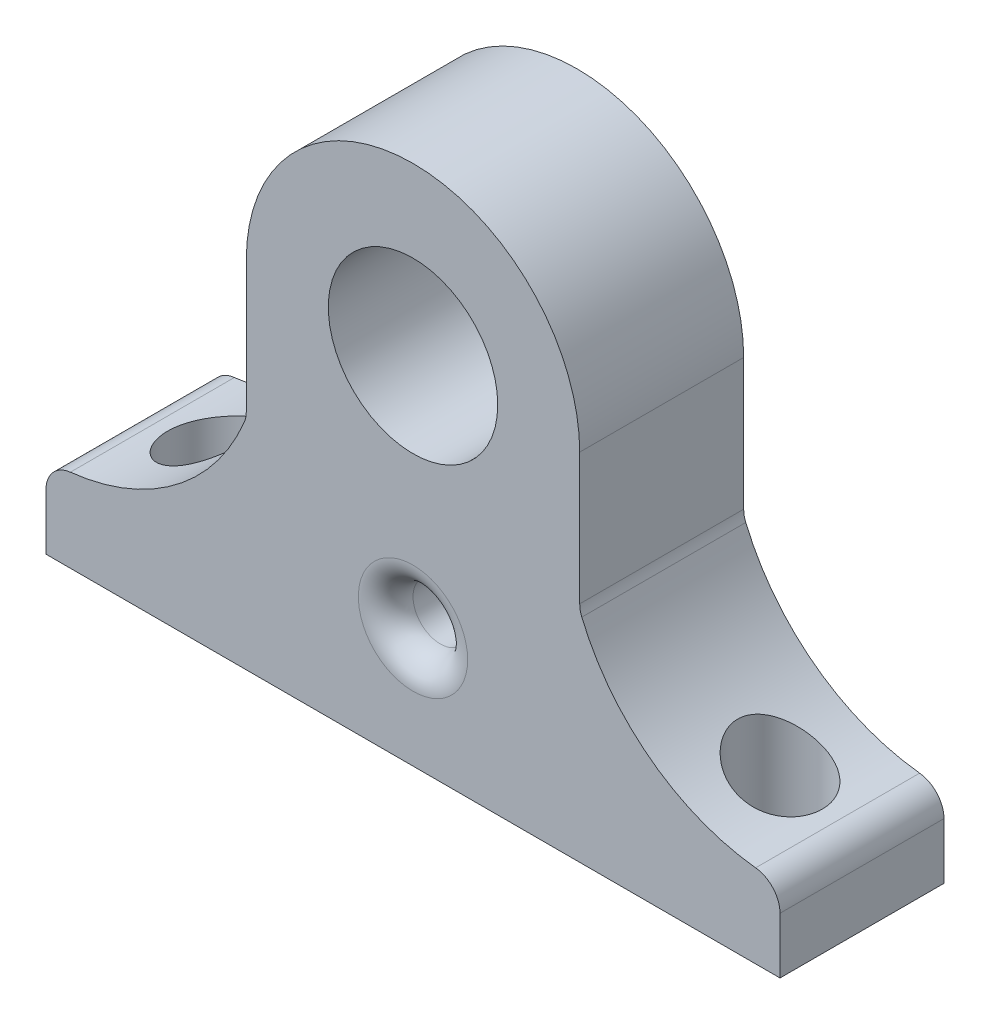
ISO-10303-21;
HEADER;
FILE_DESCRIPTION(('STEP AP214'),'2;1');
FILE_NAME('part.step','',(''),(''),'','','');
FILE_SCHEMA(('AUTOMOTIVE_DESIGN { 1 0 10303 214 1 1 1 1 }'));
ENDSEC;
DATA;
#1=APPLICATION_CONTEXT('core data for automotive mechanical design processes');
#2=APPLICATION_PROTOCOL_DEFINITION('international standard','automotive_design',2000,#1);
#3=PRODUCT_CONTEXT('',#1,'mechanical');
#4=PRODUCT('Part','Part','',(#3));
#5=PRODUCT_RELATED_PRODUCT_CATEGORY('part','',(#4));
#6=PRODUCT_DEFINITION_FORMATION('','',#4);
#7=PRODUCT_DEFINITION_CONTEXT('part definition',#1,'design');
#8=PRODUCT_DEFINITION('design','',#6,#7);
#9=PRODUCT_DEFINITION_SHAPE('','',#8);
#10=(LENGTH_UNIT() NAMED_UNIT(*) SI_UNIT(.MILLI.,.METRE.));
#11=(NAMED_UNIT(*) PLANE_ANGLE_UNIT() SI_UNIT($,.RADIAN.));
#12=(NAMED_UNIT(*) SI_UNIT($,.STERADIAN.) SOLID_ANGLE_UNIT());
#13=UNCERTAINTY_MEASURE_WITH_UNIT(LENGTH_MEASURE(1.E-05),#10,'distance_accuracy_value','');
#14=(GEOMETRIC_REPRESENTATION_CONTEXT(3) GLOBAL_UNCERTAINTY_ASSIGNED_CONTEXT((#13)) GLOBAL_UNIT_ASSIGNED_CONTEXT((#10,
#11,#12)) REPRESENTATION_CONTEXT('',''));
#15=CARTESIAN_POINT('',(0.,0.,0.));
#16=DIRECTION('',(0.,0.,1.));
#17=DIRECTION('',(1.,0.,0.));
#18=AXIS2_PLACEMENT_3D('',#15,#16,#17);
#19=CARTESIAN_POINT('',(13.3824553510482,-2.1968041426794,6.));
#20=DIRECTION('',(0.,0.,-1.));
#21=DIRECTION('',(-1.,0.,0.));
#22=AXIS2_PLACEMENT_3D('',#19,#20,#21);
#23=CYLINDRICAL_SURFACE('',#22,7.80333665520784);
#24=CARTESIAN_POINT('',(11.9793314302877,-9.87295592710236,3.));
#25=CARTESIAN_POINT('',(11.9793308176853,-9.87295604934346,2.91426645997422));
#26=CARTESIAN_POINT('',(11.9721989109455,-9.87166250307911,2.82852605199189));
#27=CARTESIAN_POINT('',(11.9438899988215,-9.86640622337288,2.65947203974016));
#28=CARTESIAN_POINT('',(11.9227111392494,-9.86244313755261,2.57615875736543));
#29=CARTESIAN_POINT('',(11.8669758804863,-9.85161866128204,2.41433771191587));
#30=CARTESIAN_POINT('',(11.8324202290169,-9.84475743282709,2.33582968052622));
#31=CARTESIAN_POINT('',(11.7510435846717,-9.82781179643712,2.18584025958658));
#32=CARTESIAN_POINT('',(11.7042233695684,-9.81772759288213,2.11435842485679));
#33=CARTESIAN_POINT('',(11.5998157868866,-9.79398241218581,1.98035031811152));
#34=CARTESIAN_POINT('',(11.5422214315455,-9.78031911144146,1.91782990493062));
#35=CARTESIAN_POINT('',(11.4181949542671,-9.7491431249181,1.80343533226207));
#36=CARTESIAN_POINT('',(11.3517628700807,-9.73163045558166,1.75156112730096));
#37=CARTESIAN_POINT('',(11.2114692888448,-9.69241859731767,1.65914469499409));
#38=CARTESIAN_POINT('',(11.1375348261629,-9.67067593371212,1.61873189489233));
#39=CARTESIAN_POINT('',(10.9852047622529,-9.62321755603048,1.5507010191938));
#40=CARTESIAN_POINT('',(10.9068085295294,-9.59750127866216,1.52308475983421));
#41=CARTESIAN_POINT('',(10.7448467920535,-9.54137339379928,1.48005478293583));
#42=CARTESIAN_POINT('',(10.6611978415935,-9.51082127789593,1.4651405839035));
#43=CARTESIAN_POINT('',(10.4938797591701,-9.44637256869516,1.44906319681281));
#44=CARTESIAN_POINT('',(10.4102106288998,-9.41247495098613,1.44790423394046));
#45=CARTESIAN_POINT('',(10.2389427575427,-9.33960833746298,1.45917794413261));
#46=CARTESIAN_POINT('',(10.1514891349887,-9.3004500788007,1.47258550988208));
#47=CARTESIAN_POINT('',(9.98086589656682,-9.22034678416242,1.51369968205406));
#48=CARTESIAN_POINT('',(9.89769797568648,-9.17940105289191,1.54141189892281));
#49=CARTESIAN_POINT('',(9.73111932488415,-9.09384954439267,1.61297287738603));
#50=CARTESIAN_POINT('',(9.64819274216054,-9.04920677577143,1.65790898515048));
#51=CARTESIAN_POINT('',(9.49123757930503,-8.96131381803098,1.76250975291866));
#52=CARTESIAN_POINT('',(9.4172163749846,-8.91806480468868,1.82218649854781));
#53=CARTESIAN_POINT('',(9.27927536645779,-8.83476757994774,1.95632346278283));
#54=CARTESIAN_POINT('',(9.21551332036543,-8.79477332026248,2.03098092168684));
#55=CARTESIAN_POINT('',(9.10212947298901,-8.72178877366752,2.19328903194234));
#56=CARTESIAN_POINT('',(9.05247766828618,-8.68878366402084,2.28091150207204));
#57=CARTESIAN_POINT('',(8.98192732207458,-8.64108020547445,2.44066016792592));
#58=CARTESIAN_POINT('',(8.95686924442442,-8.6238439071569,2.51020460072468));
#59=CARTESIAN_POINT('',(8.91676008752412,-8.59604082199032,2.65338948124215));
#60=CARTESIAN_POINT('',(8.90169967325654,-8.58546781396302,2.72702603822805));
#61=CARTESIAN_POINT('',(8.88239662122395,-8.57188696080883,2.87669060760846));
#62=CARTESIAN_POINT('',(8.87819431922363,-8.56890732413235,2.95272647783662));
#63=CARTESIAN_POINT('',(8.88099664894198,-8.57088721013524,3.10449229558593));
#64=CARTESIAN_POINT('',(8.88800193607048,-8.57584719711674,3.18022222495629));
#65=CARTESIAN_POINT('',(8.91205522520267,-8.59272311230545,3.32470248302036));
#66=CARTESIAN_POINT('',(8.92850431529527,-8.60422385812084,3.39360402669299));
#67=CARTESIAN_POINT('',(8.97014241654492,-8.63296706712486,3.52743045672301));
#68=CARTESIAN_POINT('',(8.99533354664715,-8.65021092232004,3.59235437446798));
#69=CARTESIAN_POINT('',(9.05573650208789,-8.69087740486557,3.72197120663483));
#70=CARTESIAN_POINT('',(9.09157712221603,-8.71467731878267,3.78625035099826));
#71=CARTESIAN_POINT('',(9.17103373178872,-8.76629697778571,3.90800877511111));
#72=CARTESIAN_POINT('',(9.21465368524723,-8.79411877087279,3.96548456320405));
#73=CARTESIAN_POINT('',(9.31631507653123,-8.85733744450267,4.08194742473156));
#74=CARTESIAN_POINT('',(9.37554848523913,-8.89322748009647,4.13962689040094));
#75=CARTESIAN_POINT('',(9.50160944687621,-8.96706592339721,4.24441132847689));
#76=CARTESIAN_POINT('',(9.56844198648776,-9.00501567408949,4.2915092960978));
#77=CARTESIAN_POINT('',(9.71824088041975,-9.0869312354326,4.38038293786414));
#78=CARTESIAN_POINT('',(9.80215499844844,-9.13099361143323,4.4204828877428));
#79=CARTESIAN_POINT('',(9.97625551696344,-9.21815360879958,4.48521063928531));
#80=CARTESIAN_POINT('',(10.0664439590509,-9.26125091005289,4.50983337842147));
#81=CARTESIAN_POINT('',(10.2539441523292,-9.34630792563741,4.54307820766243));
#82=CARTESIAN_POINT('',(10.3513921686673,-9.38818508699997,4.55115400141704));
#83=CARTESIAN_POINT('',(10.5477332655099,-9.46781632751943,4.54858192191958));
#84=CARTESIAN_POINT('',(10.6466257006179,-9.50557218789542,4.53794217179448));
#85=CARTESIAN_POINT('',(10.8359744969157,-9.5735899058304,4.49862557704788));
#86=CARTESIAN_POINT('',(10.9265633314799,-9.60417819583256,4.47115744846272));
#87=CARTESIAN_POINT('',(11.1025225973619,-9.66021404834842,4.39940170581359));
#88=CARTESIAN_POINT('',(11.1878958349472,-9.68566439264441,4.35512323080428));
#89=CARTESIAN_POINT('',(11.3433471350419,-9.72940692800912,4.25496019592658));
#90=CARTESIAN_POINT('',(11.4141039968313,-9.74811199936851,4.20030654686936));
#91=CARTESIAN_POINT('',(11.5456696113472,-9.78118865616113,4.07902090429581));
#92=CARTESIAN_POINT('',(11.6064806860614,-9.79556125373538,4.01239171428862));
#93=CARTESIAN_POINT('',(11.7134533541162,-9.81975497460249,3.87232571170571));
#94=CARTESIAN_POINT('',(11.7601466523453,-9.82975025655552,3.79932408989287));
#95=CARTESIAN_POINT('',(11.8408235548187,-9.84645376303724,3.64627281749373));
#96=CARTESIAN_POINT('',(11.8748100574686,-9.85316273727742,3.56622477933989));
#97=CARTESIAN_POINT('',(11.9274551774376,-9.86333645569161,3.40600351833296));
#98=CARTESIAN_POINT('',(11.9468610491995,-9.86696085835424,3.32608478225735));
#99=CARTESIAN_POINT('',(11.9727994178019,-9.87177052589572,3.16411278348783));
#100=CARTESIAN_POINT('',(11.9793320166377,-9.87295581009974,3.08205953771091));
#101=CARTESIAN_POINT('',(11.9793314302877,-9.87295592710236,3.));
#102=B_SPLINE_CURVE_WITH_KNOTS('',3,(#24,#25,#26,#27,#28,#29,#30,#31,#32,#33,#34,#35,#36,#37,
#38,#39,#40,#41,#42,#43,#44,#45,#46,#47,#48,#49,#50,#51,#52,#53,#54,#55,#56,#57,#58,#59,#60,#61,
#62,#63,#64,#65,#66,#67,#68,#69,#70,#71,#72,#73,#74,#75,#76,#77,#78,#79,#80,#81,#82,#83,#84,#85,
#86,#87,#88,#89,#90,#91,#92,#93,#94,#95,#96,#97,#98,#99,#100,#101),.UNSPECIFIED.,.T.,.F.,(4,2,2,
2,2,2,2,2,2,2,2,2,2,2,2,2,2,2,2,2,2,2,2,2,2,2,2,2,2,2,2,2,2,2,2,2,2,2,4),(0.,0.256908747777572,
0.513851414078965,0.770779720144769,1.02769173672708,1.28477095956893,1.54184908431767,
1.8017241107434,2.06163601043277,2.33135080923651,2.60114845399776,2.89018104765351,
3.17932708939989,3.49096039450065,3.80285005607597,4.11915302264239,4.43477829569671,
4.66154980755536,4.88810927939087,5.11550917328809,5.34292236581443,5.5572950541888,
5.77171973976417,6.00288516495627,6.23416872042936,6.50351044944692,6.7730299565221,
7.08039104267377,7.38785261304217,7.70531135691413,8.0226323478338,8.31946881526352,
8.61614413616405,8.88878390841021,9.16135993782516,9.42179972014187,9.68218006014343,
9.92808125708142,10.1739805057323),.UNSPECIFIED.);
#103=CARTESIAN_POINT('',(11.9793314302877,-9.87295592710236,3.));
#104=VERTEX_POINT('',#103);
#105=EDGE_CURVE('E233',#104,#104,#102,.T.);
#106=ORIENTED_EDGE('',*,*,#105,.F.);
#107=EDGE_LOOP('',(#106));
#108=FACE_BOUND('',#107,.T.);
#109=CARTESIAN_POINT('',(13.3824553510482,-2.1968041426794,6.));
#110=DIRECTION('',(0.,0.,1.));
#111=DIRECTION('',(1.,0.,0.));
#112=AXIS2_PLACEMENT_3D('',#109,#110,#111);
#113=CIRCLE('',#112,7.80333665520784);
#114=CARTESIAN_POINT('',(6.17656262368861,-5.19132797065208,6.));
#115=VERTEX_POINT('',#114);
#116=CARTESIAN_POINT('',(12.5375999150782,-9.95427036863373,6.));
#117=VERTEX_POINT('',#116);
#118=EDGE_CURVE('E132',#115,#117,#113,.T.);
#119=ORIENTED_EDGE('',*,*,#118,.T.);
#120=DIRECTION('',(0.,0.,-1.));
#121=VECTOR('',#120,1.);
#122=CARTESIAN_POINT('',(12.5375999150782,-9.95427036863373,6.));
#123=LINE('',#122,#121);
#124=CARTESIAN_POINT('',(12.5375999150782,-9.95427036863373,0.));
#125=VERTEX_POINT('',#124);
#126=EDGE_CURVE('E47',#117,#125,#123,.T.);
#127=ORIENTED_EDGE('',*,*,#126,.T.);
#128=CARTESIAN_POINT('',(13.3824553510482,-2.1968041426794,0.));
#129=DIRECTION('',(0.,0.,1.));
#130=DIRECTION('',(1.,0.,0.));
#131=AXIS2_PLACEMENT_3D('',#128,#129,#130);
#132=CIRCLE('',#131,7.80333665520784);
#133=CARTESIAN_POINT('',(6.17656262368861,-5.19132797065208,0.));
#134=VERTEX_POINT('',#133);
#135=EDGE_CURVE('E135',#134,#125,#132,.T.);
#136=ORIENTED_EDGE('',*,*,#135,.F.);
#137=DIRECTION('',(0.,0.,-1.));
#138=VECTOR('',#137,1.);
#139=CARTESIAN_POINT('',(6.17656262368861,-5.19132797065208,6.));
#140=LINE('',#139,#138);
#141=EDGE_CURVE('E128',#115,#134,#140,.T.);
#142=ORIENTED_EDGE('',*,*,#141,.F.);
#143=EDGE_LOOP('',(#119,#127,#136,#142));
#144=FACE_BOUND('',#143,.T.);
#145=ADVANCED_FACE('F39',(#108,#144),#23,.F.);
#146=CARTESIAN_POINT('',(7.1,-4.80757881816944,6.));
#147=DIRECTION('',(0.,0.,-1.));
#148=DIRECTION('',(-1.,0.,0.));
#149=AXIS2_PLACEMENT_3D('',#146,#147,#148);
#150=CYLINDRICAL_SURFACE('',#149,1.);
#151=CARTESIAN_POINT('',(7.1,-4.80757881816944,0.));
#152=DIRECTION('',(0.,0.,1.));
#153=DIRECTION('',(1.,0.,0.));
#154=AXIS2_PLACEMENT_3D('',#151,#152,#153);
#155=CIRCLE('',#154,1.);
#156=CARTESIAN_POINT('',(6.1,-4.80757881816944,0.));
#157=VERTEX_POINT('',#156);
#158=EDGE_CURVE('E193',#134,#157,#155,.F.);
#159=ORIENTED_EDGE('',*,*,#158,.T.);
#160=DIRECTION('',(0.,0.,-1.));
#161=VECTOR('',#160,1.);
#162=CARTESIAN_POINT('',(6.1,-4.80757881816944,6.));
#163=LINE('',#162,#161);
#164=CARTESIAN_POINT('',(6.1,-4.80757881816944,6.));
#165=VERTEX_POINT('',#164);
#166=EDGE_CURVE('E140',#165,#157,#163,.T.);
#167=ORIENTED_EDGE('',*,*,#166,.F.);
#168=CARTESIAN_POINT('',(7.1,-4.80757881816944,6.));
#169=DIRECTION('',(0.,0.,1.));
#170=DIRECTION('',(1.,0.,0.));
#171=AXIS2_PLACEMENT_3D('',#168,#169,#170);
#172=CIRCLE('',#171,1.);
#173=EDGE_CURVE('E143',#115,#165,#172,.F.);
#174=ORIENTED_EDGE('',*,*,#173,.F.);
#175=ORIENTED_EDGE('',*,*,#141,.T.);
#176=EDGE_LOOP('',(#159,#167,#174,#175));
#177=FACE_BOUND('',#176,.T.);
#178=ADVANCED_FACE('F144',(#177),#150,.F.);
#179=CARTESIAN_POINT('',(6.1,0.,6.));
#180=DIRECTION('',(1.,0.,0.));
#181=DIRECTION('',(0.,1.,0.));
#182=AXIS2_PLACEMENT_3D('',#179,#180,#181);
#183=PLANE('',#182);
#184=DIRECTION('',(0.,-1.,0.));
#185=VECTOR('',#184,1.);
#186=CARTESIAN_POINT('',(6.1,0.,0.));
#187=LINE('',#186,#185);
#188=CARTESIAN_POINT('',(6.1,0.,0.));
#189=VERTEX_POINT('',#188);
#190=EDGE_CURVE('E195',#189,#157,#187,.T.);
#191=ORIENTED_EDGE('',*,*,#190,.F.);
#192=DIRECTION('',(0.,0.,-1.));
#193=VECTOR('',#192,1.);
#194=CARTESIAN_POINT('',(6.1,0.,6.));
#195=LINE('',#194,#193);
#196=CARTESIAN_POINT('',(6.1,0.,6.));
#197=VERTEX_POINT('',#196);
#198=EDGE_CURVE('E227',#197,#189,#195,.T.);
#199=ORIENTED_EDGE('',*,*,#198,.F.);
#200=DIRECTION('',(0.,-1.,0.));
#201=VECTOR('',#200,1.);
#202=CARTESIAN_POINT('',(6.1,0.,6.));
#203=LINE('',#202,#201);
#204=EDGE_CURVE('E148',#197,#165,#203,.T.);
#205=ORIENTED_EDGE('',*,*,#204,.T.);
#206=ORIENTED_EDGE('',*,*,#166,.T.);
#207=EDGE_LOOP('',(#191,#199,#205,#206));
#208=FACE_BOUND('',#207,.T.);
#209=ADVANCED_FACE('F264',(#208),#183,.T.);
#210=CARTESIAN_POINT('',(0.,0.,6.));
#211=DIRECTION('',(0.,0.,-1.));
#212=DIRECTION('',(-1.,0.,0.));
#213=AXIS2_PLACEMENT_3D('',#210,#211,#212);
#214=CYLINDRICAL_SURFACE('',#213,6.1);
#215=CARTESIAN_POINT('',(0.,0.,0.));
#216=DIRECTION('',(0.,0.,1.));
#217=DIRECTION('',(1.,0.,0.));
#218=AXIS2_PLACEMENT_3D('',#215,#216,#217);
#219=CIRCLE('',#218,6.1);
#220=CARTESIAN_POINT('',(-6.1,0.,0.));
#221=VERTEX_POINT('',#220);
#222=EDGE_CURVE('E198',#189,#221,#219,.T.);
#223=ORIENTED_EDGE('',*,*,#222,.T.);
#224=DIRECTION('',(0.,0.,-1.));
#225=VECTOR('',#224,1.);
#226=CARTESIAN_POINT('',(-6.1,0.,6.));
#227=LINE('',#226,#225);
#228=CARTESIAN_POINT('',(-6.1,0.,6.));
#229=VERTEX_POINT('',#228);
#230=EDGE_CURVE('E224',#229,#221,#227,.T.);
#231=ORIENTED_EDGE('',*,*,#230,.F.);
#232=CARTESIAN_POINT('',(0.,0.,6.));
#233=DIRECTION('',(0.,0.,1.));
#234=DIRECTION('',(1.,0.,0.));
#235=AXIS2_PLACEMENT_3D('',#232,#233,#234);
#236=CIRCLE('',#235,6.1);
#237=EDGE_CURVE('E171',#197,#229,#236,.T.);
#238=ORIENTED_EDGE('',*,*,#237,.F.);
#239=ORIENTED_EDGE('',*,*,#198,.T.);
#240=EDGE_LOOP('',(#223,#231,#238,#239));
#241=FACE_BOUND('',#240,.T.);
#242=ADVANCED_FACE('F270',(#241),#214,.T.);
#243=CARTESIAN_POINT('',(-6.1,0.,6.));
#244=DIRECTION('',(1.,0.,0.));
#245=DIRECTION('',(0.,1.,0.));
#246=AXIS2_PLACEMENT_3D('',#243,#244,#245);
#247=PLANE('',#246);
#248=DIRECTION('',(0.,-1.,0.));
#249=VECTOR('',#248,1.);
#250=CARTESIAN_POINT('',(-6.1,0.,0.));
#251=LINE('',#250,#249);
#252=CARTESIAN_POINT('',(-6.1,-4.80757881816944,0.));
#253=VERTEX_POINT('',#252);
#254=EDGE_CURVE('E201',#221,#253,#251,.T.);
#255=ORIENTED_EDGE('',*,*,#254,.T.);
#256=DIRECTION('',(0.,0.,-1.));
#257=VECTOR('',#256,1.);
#258=CARTESIAN_POINT('',(-6.1,-4.80757881816944,6.));
#259=LINE('',#258,#257);
#260=CARTESIAN_POINT('',(-6.1,-4.80757881816944,6.));
#261=VERTEX_POINT('',#260);
#262=EDGE_CURVE('E222',#261,#253,#259,.T.);
#263=ORIENTED_EDGE('',*,*,#262,.F.);
#264=DIRECTION('',(0.,-1.,0.));
#265=VECTOR('',#264,1.);
#266=CARTESIAN_POINT('',(-6.1,0.,6.));
#267=LINE('',#266,#265);
#268=EDGE_CURVE('E174',#229,#261,#267,.T.);
#269=ORIENTED_EDGE('',*,*,#268,.F.);
#270=ORIENTED_EDGE('',*,*,#230,.T.);
#271=EDGE_LOOP('',(#255,#263,#269,#270));
#272=FACE_BOUND('',#271,.T.);
#273=ADVANCED_FACE('F272',(#272),#247,.F.);
#274=CARTESIAN_POINT('',(-7.1,-4.80757881816944,6.));
#275=DIRECTION('',(0.,0.,-1.));
#276=DIRECTION('',(-1.,0.,0.));
#277=AXIS2_PLACEMENT_3D('',#274,#275,#276);
#278=CYLINDRICAL_SURFACE('',#277,1.);
#279=CARTESIAN_POINT('',(-7.1,-4.80757881816944,0.));
#280=DIRECTION('',(0.,0.,1.));
#281=DIRECTION('',(1.,0.,0.));
#282=AXIS2_PLACEMENT_3D('',#279,#280,#281);
#283=CIRCLE('',#282,1.);
#284=CARTESIAN_POINT('',(-6.17656262368861,-5.19132797065208,0.));
#285=VERTEX_POINT('',#284);
#286=EDGE_CURVE('E204',#285,#253,#283,.T.);
#287=ORIENTED_EDGE('',*,*,#286,.F.);
#288=DIRECTION('',(0.,0.,-1.));
#289=VECTOR('',#288,1.);
#290=CARTESIAN_POINT('',(-6.17656262368861,-5.19132797065208,6.));
#291=LINE('',#290,#289);
#292=CARTESIAN_POINT('',(-6.17656262368861,-5.19132797065208,6.));
#293=VERTEX_POINT('',#292);
#294=EDGE_CURVE('E220',#293,#285,#291,.T.);
#295=ORIENTED_EDGE('',*,*,#294,.F.);
#296=CARTESIAN_POINT('',(-7.1,-4.80757881816944,6.));
#297=DIRECTION('',(0.,0.,1.));
#298=DIRECTION('',(1.,0.,0.));
#299=AXIS2_PLACEMENT_3D('',#296,#297,#298);
#300=CIRCLE('',#299,1.);
#301=EDGE_CURVE('E176',#293,#261,#300,.T.);
#302=ORIENTED_EDGE('',*,*,#301,.T.);
#303=ORIENTED_EDGE('',*,*,#262,.T.);
#304=EDGE_LOOP('',(#287,#295,#302,#303));
#305=FACE_BOUND('',#304,.T.);
#306=ADVANCED_FACE('F275',(#305),#278,.F.);
#307=CARTESIAN_POINT('',(-13.3824553510482,-2.1968041426794,6.));
#308=DIRECTION('',(0.,0.,-1.));
#309=DIRECTION('',(-1.,0.,0.));
#310=AXIS2_PLACEMENT_3D('',#307,#308,#309);
#311=CYLINDRICAL_SURFACE('',#310,7.80333665520784);
#312=CARTESIAN_POINT('',(-8.87933143028766,-8.5697106937583,3.));
#313=CARTESIAN_POINT('',(-8.87933249906697,-8.56971177998738,3.07676569908592));
#314=CARTESIAN_POINT('',(-8.88506789121121,-8.57377578757113,3.15353946899574));
#315=CARTESIAN_POINT('',(-8.90763807890863,-8.58963257676071,3.30461809561081));
#316=CARTESIAN_POINT('',(-8.92447868749311,-8.6014294060968,3.37892163786572));
#317=CARTESIAN_POINT('',(-8.9681783777173,-8.63162463541346,3.52263795828312));
#318=CARTESIAN_POINT('',(-8.99498801418457,-8.64999043723119,3.5920728968491));
#319=CARTESIAN_POINT('',(-9.05742224379567,-8.69199951638153,3.72510071901316));
#320=CARTESIAN_POINT('',(-9.09304948240991,-8.71564437733665,3.78869184147454));
#321=CARTESIAN_POINT('',(-9.17529723942948,-8.76905505425345,3.91433496954806));
#322=CARTESIAN_POINT('',(-9.2225972205023,-8.79917135408159,3.97579056111232));
#323=CARTESIAN_POINT('',(-9.32482214651296,-8.86248456386017,4.09016043537786));
#324=CARTESIAN_POINT('',(-9.37975075623219,-8.89568295188446,4.14307058628047));
#325=CARTESIAN_POINT('',(-9.50596233839241,-8.96962245174401,4.24808665148194));
#326=CARTESIAN_POINT('',(-9.57843910570153,-9.01068800056939,4.29853483015391));
#327=CARTESIAN_POINT('',(-9.73062223721989,-9.09344770590427,4.38637394757041));
#328=CARTESIAN_POINT('',(-9.81033306059641,-9.13514223674337,4.42375676283899));
#329=CARTESIAN_POINT('',(-9.98278794190484,-9.22136208014608,4.48737393062832));
#330=CARTESIAN_POINT('',(-10.0760594965599,-9.26580502167292,4.51230435739069));
#331=CARTESIAN_POINT('',(-10.266853720762,-9.351944718448,4.54449172816259));
#332=CARTESIAN_POINT('',(-10.3643759873761,-9.39364173305099,4.55175034362344));
#333=CARTESIAN_POINT('',(-10.5582079785727,-9.47185232083132,4.54759163862819));
#334=CARTESIAN_POINT('',(-10.6544840105474,-9.5084719203592,4.53665162010399));
#335=CARTESIAN_POINT('',(-10.8449465803098,-9.57673161650841,4.49640240803181));
#336=CARTESIAN_POINT('',(-10.9391343225371,-9.60837465116076,4.46710410403841));
#337=CARTESIAN_POINT('',(-11.1140215742569,-9.66366358411777,4.39353454751649));
#338=CARTESIAN_POINT('',(-11.1951910083222,-9.68775618351436,4.35071462043025));
#339=CARTESIAN_POINT('',(-11.3495460404184,-9.73111037470431,4.25066075434087));
#340=CARTESIAN_POINT('',(-11.4227347434658,-9.75037384915373,4.19343245000305));
#341=CARTESIAN_POINT('',(-11.553856599025,-9.78314546920305,4.07028441170937));
#342=CARTESIAN_POINT('',(-11.6124694629738,-9.79694481176545,4.00516394470544));
#343=CARTESIAN_POINT('',(-11.718134558734,-9.82078214935235,3.86553295676786));
#344=CARTESIAN_POINT('',(-11.7651886045103,-9.83082073469536,3.79102391199614));
#345=CARTESIAN_POINT('',(-11.8450805169467,-9.8473055012803,3.63679531903396));
#346=CARTESIAN_POINT('',(-11.8782475727336,-9.85383605056844,3.55725501495911));
#347=CARTESIAN_POINT('',(-11.9309832254865,-9.86400820707206,3.39361240241077));
#348=CARTESIAN_POINT('',(-11.950552278521,-9.86764991117814,3.30951024704085));
#349=CARTESIAN_POINT('',(-11.975415101717,-9.87224954228011,3.13953665863706));
#350=CARTESIAN_POINT('',(-11.9807722559255,-9.87321938632776,3.05367480837134));
#351=CARTESIAN_POINT('',(-11.977228446417,-9.87257141752275,2.88225536571918));
#352=CARTESIAN_POINT('',(-11.9683275342064,-9.87095361401781,2.79669777223474));
#353=CARTESIAN_POINT('',(-11.9365442869463,-9.86502832789744,2.62831442920402));
#354=CARTESIAN_POINT('',(-11.9136616705016,-9.86072079114848,2.54548873467521));
#355=CARTESIAN_POINT('',(-11.8546376773843,-9.84917203782944,2.38492465745258));
#356=CARTESIAN_POINT('',(-11.8184966295377,-9.84193089401612,2.30718614864638));
#357=CARTESIAN_POINT('',(-11.7341197843526,-9.82418266141555,2.15899044150225));
#358=CARTESIAN_POINT('',(-11.6858842807286,-9.81367565193855,2.08853306640023));
#359=CARTESIAN_POINT('',(-11.5789033360301,-9.78905457447864,1.95684071416797));
#360=CARTESIAN_POINT('',(-11.5201582495576,-9.77494062818991,1.89560542600512));
#361=CARTESIAN_POINT('',(-11.3938027996632,-9.74276890618378,1.78367280907601));
#362=CARTESIAN_POINT('',(-11.3261523300708,-9.72469302678372,1.7330260100109));
#363=CARTESIAN_POINT('',(-11.1844204247021,-9.68453580697433,1.64377104280668));
#364=CARTESIAN_POINT('',(-11.1103385725576,-9.66245420713328,1.6051636548444));
#365=CARTESIAN_POINT('',(-10.9562260084606,-9.61382181135451,1.53984468588219));
#366=CARTESIAN_POINT('',(-10.8760953256348,-9.5871766595554,1.51344009301344));
#367=CARTESIAN_POINT('',(-10.7138941457953,-9.53016899365734,1.47405905355474));
#368=CARTESIAN_POINT('',(-10.6318231763616,-9.49980556655367,1.46108591241662));
#369=CARTESIAN_POINT('',(-10.4631782013743,-9.43410549938075,1.44793262022047));
#370=CARTESIAN_POINT('',(-10.3766164661107,-9.39858333440917,1.44853051755797));
#371=CARTESIAN_POINT('',(-10.2058896421993,-9.32492813505259,1.46379439363643));
#372=CARTESIAN_POINT('',(-10.1217253415604,-9.28679425593371,1.47846494418698));
#373=CARTESIAN_POINT('',(-9.95092768997596,-9.20582080755803,1.52282937152206));
#374=CARTESIAN_POINT('',(-9.86464704905378,-9.16285033990012,1.55364445162431));
#375=CARTESIAN_POINT('',(-9.69886504830944,-9.07662772593842,1.62987112389903));
#376=CARTESIAN_POINT('',(-9.61936916169503,-9.03337538196019,1.67529436212584));
#377=CARTESIAN_POINT('',(-9.46499807783419,-8.94616403163625,1.78267903358422));
#378=CARTESIAN_POINT('',(-9.3905953195228,-8.90229032989398,1.84539319336375));
#379=CARTESIAN_POINT('',(-9.25372251384532,-8.81889175145667,1.9851192757403));
#380=CARTESIAN_POINT('',(-9.1912394683878,-8.77936215782193,2.06211544135511));
#381=CARTESIAN_POINT('',(-9.09370212838392,-8.71610082114183,2.2097380193028));
#382=CARTESIAN_POINT('',(-9.05564599711646,-8.69082919363768,2.27772630033109));
#383=CARTESIAN_POINT('',(-8.98968375078758,-8.64639372574374,2.42029180888287));
#384=CARTESIAN_POINT('',(-8.96176456513625,-8.62722202407802,2.49486039633868));
#385=CARTESIAN_POINT('',(-8.91989405321079,-8.59822522905483,2.64054691403466));
#386=CARTESIAN_POINT('',(-8.90475888609781,-8.5876136902221,2.71116621252393));
#387=CARTESIAN_POINT('',(-8.88447846217613,-8.57335687994503,2.85452165597697));
#388=CARTESIAN_POINT('',(-8.87933041751769,-8.569709664453,2.92725720444539));
#389=CARTESIAN_POINT('',(-8.87933143028766,-8.5697106937583,3.));
#390=B_SPLINE_CURVE_WITH_KNOTS('',3,(#312,#313,#314,#315,#316,#317,#318,#319,#320,#321,#322,
#323,#324,#325,#326,#327,#328,#329,#330,#331,#332,#333,#334,#335,#336,#337,#338,#339,#340,#341,
#342,#343,#344,#345,#346,#347,#348,#349,#350,#351,#352,#353,#354,#355,#356,#357,#358,#359,#360,
#361,#362,#363,#364,#365,#366,#367,#368,#369,#370,#371,#372,#373,#374,#375,#376,#377,#378,#379,
#380,#381,#382,#383,#384,#385,#386,#387,#388,#389),.UNSPECIFIED.,.T.,.F.,(4,2,2,2,2,2,2,2,2,2,2,
2,2,2,2,2,2,2,2,2,2,2,2,2,2,2,2,2,2,2,2,2,2,2,2,2,2,2,4),(0.,0.230003158116456,
0.460126807175947,0.68912397320951,0.918189926783383,1.16684014383522,1.41561022793226,
1.706564036859,1.99769842775357,2.31499847957626,2.63226851907067,2.94134788766751,
3.25024409348329,3.53339709311017,3.81643953199454,4.08121542161257,4.34594973245981,
4.60399434773509,4.86203030794121,5.11891349632395,5.3757957567339,5.63268318731768,
5.88956424719452,6.14643906930394,6.40330522587534,6.66137053021969,6.91945255421505,
7.18371448342566,7.44804143149023,7.72755901893642,8.00716744455769,8.3094366975164,
8.61194752830338,8.93058951124532,9.24888201311936,9.49363857250315,9.73807841223569,
9.95608912886919,10.1740389802612),.UNSPECIFIED.);
#391=CARTESIAN_POINT('',(-8.87933143028766,-8.5697106937583,3.));
#392=VERTEX_POINT('',#391);
#393=EDGE_CURVE('E162',#392,#392,#390,.T.);
#394=ORIENTED_EDGE('',*,*,#393,.T.);
#395=EDGE_LOOP('',(#394));
#396=FACE_BOUND('',#395,.T.);
#397=CARTESIAN_POINT('',(-13.3824553510482,-2.1968041426794,0.));
#398=DIRECTION('',(0.,0.,1.));
#399=DIRECTION('',(1.,0.,0.));
#400=AXIS2_PLACEMENT_3D('',#397,#398,#399);
#401=CIRCLE('',#400,7.80333665520784);
#402=CARTESIAN_POINT('',(-12.5375999150782,-9.95427036863373,0.));
#403=VERTEX_POINT('',#402);
#404=EDGE_CURVE('E207',#285,#403,#401,.F.);
#405=ORIENTED_EDGE('',*,*,#404,.T.);
#406=DIRECTION('',(0.,0.,-1.));
#407=VECTOR('',#406,1.);
#408=CARTESIAN_POINT('',(-12.5375999150782,-9.95427036863373,6.));
#409=LINE('',#408,#407);
#410=CARTESIAN_POINT('',(-12.5375999150782,-9.95427036863373,6.));
#411=VERTEX_POINT('',#410);
#412=EDGE_CURVE('E256',#403,#411,#409,.F.);
#413=ORIENTED_EDGE('',*,*,#412,.T.);
#414=CARTESIAN_POINT('',(-13.3824553510482,-2.1968041426794,6.));
#415=DIRECTION('',(0.,0.,1.));
#416=DIRECTION('',(1.,0.,0.));
#417=AXIS2_PLACEMENT_3D('',#414,#415,#416);
#418=CIRCLE('',#417,7.80333665520784);
#419=EDGE_CURVE('E179',#293,#411,#418,.F.);
#420=ORIENTED_EDGE('',*,*,#419,.F.);
#421=ORIENTED_EDGE('',*,*,#294,.T.);
#422=EDGE_LOOP('',(#405,#413,#420,#421));
#423=FACE_BOUND('',#422,.T.);
#424=ADVANCED_FACE('F452',(#396,#423),#311,.F.);
#425=CARTESIAN_POINT('',(-13.4293314302877,0.,6.));
#426=DIRECTION('',(1.,0.,0.));
#427=DIRECTION('',(0.,0.,-1.));
#428=AXIS2_PLACEMENT_3D('',#425,#426,#427);
#429=PLANE('',#428);
#430=DIRECTION('',(0.,-1.,0.));
#431=VECTOR('',#430,1.);
#432=CARTESIAN_POINT('',(-13.4293314302877,0.,6.));
#433=LINE('',#432,#431);
#434=CARTESIAN_POINT('',(-13.4293314302877,-10.9483920589721,6.));
#435=VERTEX_POINT('',#434);
#436=CARTESIAN_POINT('',(-13.4293314302877,-13.,6.));
#437=VERTEX_POINT('',#436);
#438=EDGE_CURVE('E181',#435,#437,#433,.T.);
#439=ORIENTED_EDGE('',*,*,#438,.F.);
#440=DIRECTION('',(0.,0.,-1.));
#441=VECTOR('',#440,1.);
#442=CARTESIAN_POINT('',(-13.4293314302877,-10.9483920589721,6.));
#443=LINE('',#442,#441);
#444=CARTESIAN_POINT('',(-13.4293314302877,-10.9483920589721,0.));
#445=VERTEX_POINT('',#444);
#446=EDGE_CURVE('E254',#435,#445,#443,.T.);
#447=ORIENTED_EDGE('',*,*,#446,.T.);
#448=DIRECTION('',(0.,-1.,0.));
#449=VECTOR('',#448,1.);
#450=CARTESIAN_POINT('',(-13.4293314302877,0.,0.));
#451=LINE('',#450,#449);
#452=CARTESIAN_POINT('',(-13.4293314302877,-13.,0.));
#453=VERTEX_POINT('',#452);
#454=EDGE_CURVE('E209',#445,#453,#451,.T.);
#455=ORIENTED_EDGE('',*,*,#454,.T.);
#456=DIRECTION('',(0.,0.,-1.));
#457=VECTOR('',#456,1.);
#458=CARTESIAN_POINT('',(-13.4293314302877,-13.,6.));
#459=LINE('',#458,#457);
#460=EDGE_CURVE('E217',#437,#453,#459,.T.);
#461=ORIENTED_EDGE('',*,*,#460,.F.);
#462=EDGE_LOOP('',(#439,#447,#455,#461));
#463=FACE_BOUND('',#462,.T.);
#464=ADVANCED_FACE('F282',(#463),#429,.F.);
#465=CARTESIAN_POINT('',(0.,-13.,6.));
#466=DIRECTION('',(0.,1.,0.));
#467=DIRECTION('',(-1.,0.,0.));
#468=AXIS2_PLACEMENT_3D('',#465,#466,#467);
#469=PLANE('',#468);
#470=CARTESIAN_POINT('',(-10.4293314302877,-13.,3.));
#471=DIRECTION('',(0.,1.,0.));
#472=DIRECTION('',(-1.,0.,0.));
#473=AXIS2_PLACEMENT_3D('',#470,#471,#472);
#474=CIRCLE('',#473,1.55);
#475=CARTESIAN_POINT('',(-11.9793314302877,-13.,3.));
#476=VERTEX_POINT('',#475);
#477=EDGE_CURVE('E234',#476,#476,#474,.T.);
#478=ORIENTED_EDGE('',*,*,#477,.T.);
#479=EDGE_LOOP('',(#478));
#480=FACE_BOUND('',#479,.T.);
#481=CARTESIAN_POINT('',(10.4293314302877,-13.,3.));
#482=DIRECTION('',(0.,1.,0.));
#483=DIRECTION('',(-1.,0.,0.));
#484=AXIS2_PLACEMENT_3D('',#481,#482,#483);
#485=CIRCLE('',#484,1.55);
#486=CARTESIAN_POINT('',(8.87933143028767,-13.,3.));
#487=VERTEX_POINT('',#486);
#488=EDGE_CURVE('E230',#487,#487,#485,.T.);
#489=ORIENTED_EDGE('',*,*,#488,.T.);
#490=EDGE_LOOP('',(#489));
#491=FACE_BOUND('',#490,.T.);
#492=DIRECTION('',(1.,0.,0.));
#493=VECTOR('',#492,1.);
#494=CARTESIAN_POINT('',(0.,-13.,0.));
#495=LINE('',#494,#493);
#496=CARTESIAN_POINT('',(13.4293314302877,-13.,0.));
#497=VERTEX_POINT('',#496);
#498=EDGE_CURVE('E211',#453,#497,#495,.T.);
#499=ORIENTED_EDGE('',*,*,#498,.T.);
#500=DIRECTION('',(0.,0.,-1.));
#501=VECTOR('',#500,1.);
#502=CARTESIAN_POINT('',(13.4293314302877,-13.,6.));
#503=LINE('',#502,#501);
#504=CARTESIAN_POINT('',(13.4293314302877,-13.,6.));
#505=VERTEX_POINT('',#504);
#506=EDGE_CURVE('E191',#505,#497,#503,.T.);
#507=ORIENTED_EDGE('',*,*,#506,.F.);
#508=DIRECTION('',(1.,0.,0.));
#509=VECTOR('',#508,1.);
#510=CARTESIAN_POINT('',(0.,-13.,6.));
#511=LINE('',#510,#509);
#512=EDGE_CURVE('E183',#437,#505,#511,.T.);
#513=ORIENTED_EDGE('',*,*,#512,.F.);
#514=ORIENTED_EDGE('',*,*,#460,.T.);
#515=EDGE_LOOP('',(#499,#507,#513,#514));
#516=FACE_BOUND('',#515,.T.);
#517=ADVANCED_FACE('F288',(#480,#491,#516),#469,.F.);
#518=CARTESIAN_POINT('',(13.4293314302876,0.,6.));
#519=DIRECTION('',(1.,0.,0.));
#520=DIRECTION('',(0.,1.,0.));
#521=AXIS2_PLACEMENT_3D('',#518,#519,#520);
#522=PLANE('',#521);
#523=DIRECTION('',(0.,-1.,0.));
#524=VECTOR('',#523,1.);
#525=CARTESIAN_POINT('',(13.4293314302876,0.,0.));
#526=LINE('',#525,#524);
#527=CARTESIAN_POINT('',(13.4293314302877,-10.9483920589721,0.));
#528=VERTEX_POINT('',#527);
#529=EDGE_CURVE('E159',#528,#497,#526,.T.);
#530=ORIENTED_EDGE('',*,*,#529,.F.);
#531=DIRECTION('',(0.,0.,-1.));
#532=VECTOR('',#531,1.);
#533=CARTESIAN_POINT('',(13.4293314302877,-10.9483920589721,6.));
#534=LINE('',#533,#532);
#535=CARTESIAN_POINT('',(13.4293314302877,-10.9483920589721,6.));
#536=VERTEX_POINT('',#535);
#537=EDGE_CURVE('E11',#528,#536,#534,.F.);
#538=ORIENTED_EDGE('',*,*,#537,.T.);
#539=DIRECTION('',(0.,-1.,0.));
#540=VECTOR('',#539,1.);
#541=CARTESIAN_POINT('',(13.4293314302876,0.,6.));
#542=LINE('',#541,#540);
#543=EDGE_CURVE('E186',#536,#505,#542,.T.);
#544=ORIENTED_EDGE('',*,*,#543,.T.);
#545=ORIENTED_EDGE('',*,*,#506,.T.);
#546=EDGE_LOOP('',(#530,#538,#544,#545));
#547=FACE_BOUND('',#546,.T.);
#548=ADVANCED_FACE('F291',(#547),#522,.T.);
#549=CARTESIAN_POINT('',(0.,-8.6293784880638,6.));
#550=DIRECTION('',(0.,0.,-1.));
#551=DIRECTION('',(-1.,0.,0.));
#552=AXIS2_PLACEMENT_3D('',#549,#550,#551);
#553=CYLINDRICAL_SURFACE('',#552,1.);
#554=CARTESIAN_POINT('',(0.,-8.6293784880638,5.));
#555=DIRECTION('',(0.,0.,1.));
#556=DIRECTION('',(1.,0.,0.));
#557=AXIS2_PLACEMENT_3D('',#554,#555,#556);
#558=CIRCLE('',#557,1.);
#559=CARTESIAN_POINT('',(1.,-8.6293784880638,5.));
#560=VERTEX_POINT('',#559);
#561=EDGE_CURVE('E239',#560,#560,#558,.T.);
#562=ORIENTED_EDGE('',*,*,#561,.T.);
#563=EDGE_LOOP('',(#562));
#564=FACE_BOUND('',#563,.T.);
#565=CARTESIAN_POINT('',(0.,-8.6293784880638,1.));
#566=DIRECTION('',(0.,0.,1.));
#567=DIRECTION('',(1.,0.,0.));
#568=AXIS2_PLACEMENT_3D('',#565,#566,#567);
#569=CIRCLE('',#568,1.);
#570=CARTESIAN_POINT('',(1.,-8.6293784880638,1.));
#571=VERTEX_POINT('',#570);
#572=EDGE_CURVE('E139',#571,#571,#569,.F.);
#573=ORIENTED_EDGE('',*,*,#572,.T.);
#574=EDGE_LOOP('',(#573));
#575=FACE_BOUND('',#574,.T.);
#576=ADVANCED_FACE('F293',(#564,#575),#553,.F.);
#577=CARTESIAN_POINT('',(0.,0.,6.));
#578=DIRECTION('',(0.,0.,-1.));
#579=DIRECTION('',(-1.,0.,0.));
#580=AXIS2_PLACEMENT_3D('',#577,#578,#579);
#581=CYLINDRICAL_SURFACE('',#580,3.1);
#582=CARTESIAN_POINT('',(0.,0.,6.));
#583=DIRECTION('',(0.,0.,1.));
#584=DIRECTION('',(1.,0.,0.));
#585=AXIS2_PLACEMENT_3D('',#582,#583,#584);
#586=CIRCLE('',#585,3.1);
#587=CARTESIAN_POINT('',(3.1,0.,6.));
#588=VERTEX_POINT('',#587);
#589=EDGE_CURVE('E188',#588,#588,#586,.T.);
#590=ORIENTED_EDGE('',*,*,#589,.T.);
#591=EDGE_LOOP('',(#590));
#592=FACE_BOUND('',#591,.T.);
#593=CARTESIAN_POINT('',(0.,0.,0.));
#594=DIRECTION('',(0.,0.,1.));
#595=DIRECTION('',(1.,0.,0.));
#596=AXIS2_PLACEMENT_3D('',#593,#594,#595);
#597=CIRCLE('',#596,3.1);
#598=CARTESIAN_POINT('',(3.1,0.,0.));
#599=VERTEX_POINT('',#598);
#600=EDGE_CURVE('E156',#599,#599,#597,.T.);
#601=ORIENTED_EDGE('',*,*,#600,.F.);
#602=EDGE_LOOP('',(#601));
#603=FACE_BOUND('',#602,.T.);
#604=ADVANCED_FACE('F299',(#592,#603),#581,.F.);
#605=CARTESIAN_POINT('',(0.,0.,6.));
#606=DIRECTION('',(0.,0.,1.));
#607=DIRECTION('',(1.,0.,0.));
#608=AXIS2_PLACEMENT_3D('',#605,#606,#607);
#609=PLANE('',#608);
#610=CARTESIAN_POINT('',(0.,-8.6293784880638,6.));
#611=DIRECTION('',(0.,0.,1.));
#612=DIRECTION('',(1.,0.,0.));
#613=AXIS2_PLACEMENT_3D('',#610,#611,#612);
#614=CIRCLE('',#613,2.);
#615=CARTESIAN_POINT('',(2.,-8.6293784880638,6.));
#616=VERTEX_POINT('',#615);
#617=EDGE_CURVE('E245',#616,#616,#614,.F.);
#618=ORIENTED_EDGE('',*,*,#617,.T.);
#619=EDGE_LOOP('',(#618));
#620=FACE_BOUND('',#619,.T.);
#621=ORIENTED_EDGE('',*,*,#419,.T.);
#622=CARTESIAN_POINT('',(-12.4293314302877,-10.9483920589721,6.));
#623=DIRECTION('',(0.,0.,1.));
#624=DIRECTION('',(1.,0.,0.));
#625=AXIS2_PLACEMENT_3D('',#622,#623,#624);
#626=CIRCLE('',#625,1.);
#627=EDGE_CURVE('E243',#411,#435,#626,.T.);
#628=ORIENTED_EDGE('',*,*,#627,.T.);
#629=ORIENTED_EDGE('',*,*,#438,.T.);
#630=ORIENTED_EDGE('',*,*,#512,.T.);
#631=ORIENTED_EDGE('',*,*,#543,.F.);
#632=CARTESIAN_POINT('',(12.4293314302877,-10.9483920589721,6.));
#633=DIRECTION('',(0.,0.,1.));
#634=DIRECTION('',(1.,0.,0.));
#635=AXIS2_PLACEMENT_3D('',#632,#633,#634);
#636=CIRCLE('',#635,1.);
#637=EDGE_CURVE('E155',#536,#117,#636,.T.);
#638=ORIENTED_EDGE('',*,*,#637,.T.);
#639=ORIENTED_EDGE('',*,*,#118,.F.);
#640=ORIENTED_EDGE('',*,*,#173,.T.);
#641=ORIENTED_EDGE('',*,*,#204,.F.);
#642=ORIENTED_EDGE('',*,*,#237,.T.);
#643=ORIENTED_EDGE('',*,*,#268,.T.);
#644=ORIENTED_EDGE('',*,*,#301,.F.);
#645=EDGE_LOOP('',(#621,#628,#629,#630,#631,#638,#639,#640,#641,#642,#643,#644));
#646=FACE_BOUND('',#645,.T.);
#647=ORIENTED_EDGE('',*,*,#589,.F.);
#648=EDGE_LOOP('',(#647));
#649=FACE_BOUND('',#648,.T.);
#650=ADVANCED_FACE('F151',(#620,#646,#649),#609,.T.);
#651=CARTESIAN_POINT('',(0.,0.,0.));
#652=DIRECTION('',(0.,0.,1.));
#653=DIRECTION('',(1.,0.,0.));
#654=AXIS2_PLACEMENT_3D('',#651,#652,#653);
#655=PLANE('',#654);
#656=CARTESIAN_POINT('',(0.,-8.6293784880638,0.));
#657=DIRECTION('',(0.,0.,1.));
#658=DIRECTION('',(1.,0.,0.));
#659=AXIS2_PLACEMENT_3D('',#656,#657,#658);
#660=CIRCLE('',#659,2.);
#661=CARTESIAN_POINT('',(2.,-8.6293784880638,0.));
#662=VERTEX_POINT('',#661);
#663=EDGE_CURVE('E251',#662,#662,#660,.T.);
#664=ORIENTED_EDGE('',*,*,#663,.T.);
#665=EDGE_LOOP('',(#664));
#666=FACE_BOUND('',#665,.T.);
#667=ORIENTED_EDGE('',*,*,#454,.F.);
#668=CARTESIAN_POINT('',(-12.4293314302877,-10.9483920589721,0.));
#669=DIRECTION('',(0.,0.,1.));
#670=DIRECTION('',(1.,0.,0.));
#671=AXIS2_PLACEMENT_3D('',#668,#669,#670);
#672=CIRCLE('',#671,1.);
#673=EDGE_CURVE('E54',#445,#403,#672,.F.);
#674=ORIENTED_EDGE('',*,*,#673,.T.);
#675=ORIENTED_EDGE('',*,*,#404,.F.);
#676=ORIENTED_EDGE('',*,*,#286,.T.);
#677=ORIENTED_EDGE('',*,*,#254,.F.);
#678=ORIENTED_EDGE('',*,*,#222,.F.);
#679=ORIENTED_EDGE('',*,*,#190,.T.);
#680=ORIENTED_EDGE('',*,*,#158,.F.);
#681=ORIENTED_EDGE('',*,*,#135,.T.);
#682=CARTESIAN_POINT('',(12.4293314302877,-10.9483920589721,0.));
#683=DIRECTION('',(0.,0.,1.));
#684=DIRECTION('',(1.,0.,0.));
#685=AXIS2_PLACEMENT_3D('',#682,#683,#684);
#686=CIRCLE('',#685,1.);
#687=EDGE_CURVE('E248',#125,#528,#686,.F.);
#688=ORIENTED_EDGE('',*,*,#687,.T.);
#689=ORIENTED_EDGE('',*,*,#529,.T.);
#690=ORIENTED_EDGE('',*,*,#498,.F.);
#691=EDGE_LOOP('',(#667,#674,#675,#676,#677,#678,#679,#680,#681,#688,#689,#690));
#692=FACE_BOUND('',#691,.T.);
#693=ORIENTED_EDGE('',*,*,#600,.T.);
#694=EDGE_LOOP('',(#693));
#695=FACE_BOUND('',#694,.T.);
#696=ADVANCED_FACE('F258',(#666,#692,#695),#655,.F.);
#697=CARTESIAN_POINT('',(10.4293314302877,6.1,3.));
#698=DIRECTION('',(0.,-1.,0.));
#699=DIRECTION('',(1.,0.,0.));
#700=AXIS2_PLACEMENT_3D('',#697,#698,#699);
#701=CYLINDRICAL_SURFACE('',#700,1.55);
#702=ORIENTED_EDGE('',*,*,#105,.T.);
#703=EDGE_LOOP('',(#702));
#704=FACE_BOUND('',#703,.T.);
#705=ORIENTED_EDGE('',*,*,#488,.F.);
#706=EDGE_LOOP('',(#705));
#707=FACE_BOUND('',#706,.T.);
#708=ADVANCED_FACE('F324',(#704,#707),#701,.F.);
#709=CARTESIAN_POINT('',(-10.4293314302877,6.1,3.));
#710=DIRECTION('',(0.,-1.,0.));
#711=DIRECTION('',(1.,0.,0.));
#712=AXIS2_PLACEMENT_3D('',#709,#710,#711);
#713=CYLINDRICAL_SURFACE('',#712,1.55);
#714=ORIENTED_EDGE('',*,*,#477,.F.);
#715=EDGE_LOOP('',(#714));
#716=FACE_BOUND('',#715,.T.);
#717=ORIENTED_EDGE('',*,*,#393,.F.);
#718=EDGE_LOOP('',(#717));
#719=FACE_BOUND('',#718,.T.);
#720=ADVANCED_FACE('F328',(#716,#719),#713,.F.);
#721=CARTESIAN_POINT('',(0.,-8.6293784880638,5.));
#722=DIRECTION('',(0.,0.,1.));
#723=DIRECTION('',(1.,0.,0.));
#724=AXIS2_PLACEMENT_3D('',#721,#722,#723);
#725=TOROIDAL_SURFACE('',#724,2.,1.);
#726=ORIENTED_EDGE('',*,*,#617,.F.);
#727=EDGE_LOOP('',(#726));
#728=FACE_BOUND('',#727,.T.);
#729=ORIENTED_EDGE('',*,*,#561,.F.);
#730=EDGE_LOOP('',(#729));
#731=FACE_BOUND('',#730,.T.);
#732=ADVANCED_FACE('F372',(#728,#731),#725,.T.);
#733=CARTESIAN_POINT('',(0.,-8.6293784880638,1.));
#734=DIRECTION('',(0.,0.,1.));
#735=DIRECTION('',(1.,0.,0.));
#736=AXIS2_PLACEMENT_3D('',#733,#734,#735);
#737=TOROIDAL_SURFACE('',#736,2.,1.);
#738=ORIENTED_EDGE('',*,*,#572,.F.);
#739=EDGE_LOOP('',(#738));
#740=FACE_BOUND('',#739,.T.);
#741=ORIENTED_EDGE('',*,*,#663,.F.);
#742=EDGE_LOOP('',(#741));
#743=FACE_BOUND('',#742,.T.);
#744=ADVANCED_FACE('F378',(#740,#743),#737,.T.);
#745=CARTESIAN_POINT('',(-12.4293314302877,-10.9483920589721,6.));
#746=DIRECTION('',(0.,0.,-1.));
#747=DIRECTION('',(-1.,0.,0.));
#748=AXIS2_PLACEMENT_3D('',#745,#746,#747);
#749=CYLINDRICAL_SURFACE('',#748,1.);
#750=ORIENTED_EDGE('',*,*,#627,.F.);
#751=ORIENTED_EDGE('',*,*,#412,.F.);
#752=ORIENTED_EDGE('',*,*,#673,.F.);
#753=ORIENTED_EDGE('',*,*,#446,.F.);
#754=EDGE_LOOP('',(#750,#751,#752,#753));
#755=FACE_BOUND('',#754,.T.);
#756=ADVANCED_FACE('F280',(#755),#749,.T.);
#757=CARTESIAN_POINT('',(12.4293314302877,-10.9483920589721,6.));
#758=DIRECTION('',(0.,0.,-1.));
#759=DIRECTION('',(-1.,0.,0.));
#760=AXIS2_PLACEMENT_3D('',#757,#758,#759);
#761=CYLINDRICAL_SURFACE('',#760,1.);
#762=ORIENTED_EDGE('',*,*,#637,.F.);
#763=ORIENTED_EDGE('',*,*,#537,.F.);
#764=ORIENTED_EDGE('',*,*,#687,.F.);
#765=ORIENTED_EDGE('',*,*,#126,.F.);
#766=EDGE_LOOP('',(#762,#763,#764,#765));
#767=FACE_BOUND('',#766,.T.);
#768=ADVANCED_FACE('F41',(#767),#761,.T.);
#769=CLOSED_SHELL('',(#145,#178,#209,#242,#273,#306,#424,#464,#517,#548,#576,#604,#650,#696,
#708,#720,#732,#744,#756,#768));
#770=MANIFOLD_SOLID_BREP('B2',#769);
#771=ADVANCED_BREP_SHAPE_REPRESENTATION('',(#18,#770),#14);
#772=SHAPE_DEFINITION_REPRESENTATION(#9,#771);
ENDSEC;
END-ISO-10303-21;
